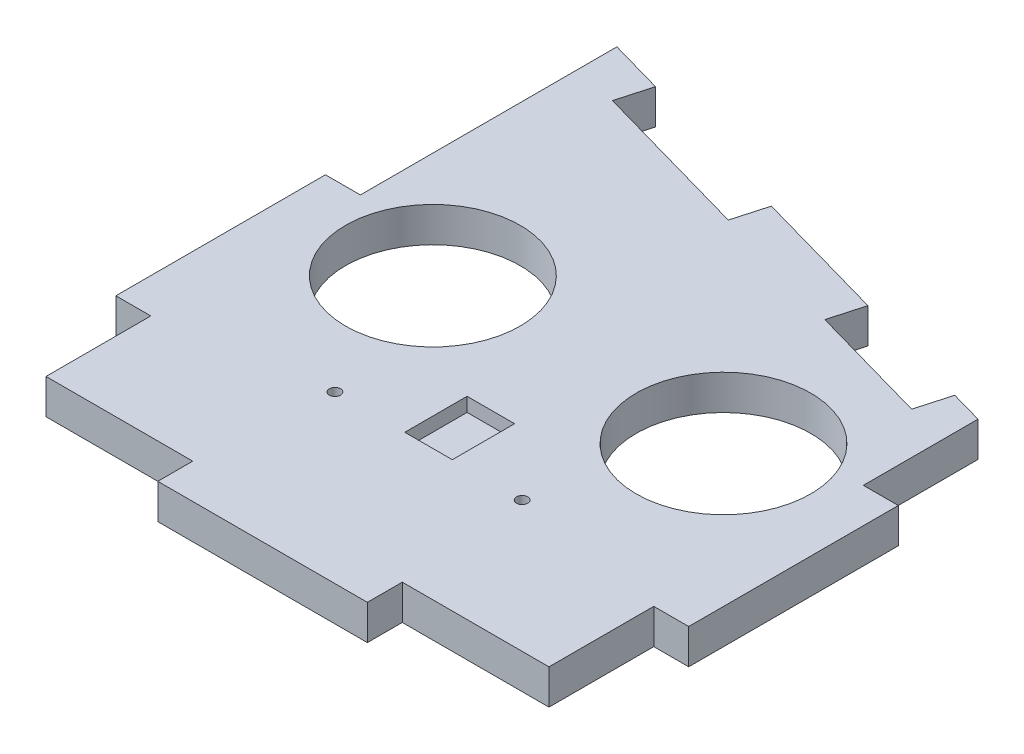
ISO-10303-21;
HEADER;
FILE_DESCRIPTION(('STEP AP214'),'2;1');
FILE_NAME('part.step','',(''),(''),'','','');
FILE_SCHEMA(('AUTOMOTIVE_DESIGN { 1 0 10303 214 1 1 1 1 }'));
ENDSEC;
DATA;
#1=APPLICATION_CONTEXT('core data for automotive mechanical design processes');
#2=APPLICATION_PROTOCOL_DEFINITION('international standard','automotive_design',2000,#1);
#3=PRODUCT_CONTEXT('',#1,'mechanical');
#4=PRODUCT('Part','Part','',(#3));
#5=PRODUCT_RELATED_PRODUCT_CATEGORY('part','',(#4));
#6=PRODUCT_DEFINITION_FORMATION('','',#4);
#7=PRODUCT_DEFINITION_CONTEXT('part definition',#1,'design');
#8=PRODUCT_DEFINITION('design','',#6,#7);
#9=PRODUCT_DEFINITION_SHAPE('','',#8);
#10=(LENGTH_UNIT() NAMED_UNIT(*) SI_UNIT(.MILLI.,.METRE.));
#11=(NAMED_UNIT(*) PLANE_ANGLE_UNIT() SI_UNIT($,.RADIAN.));
#12=(NAMED_UNIT(*) SI_UNIT($,.STERADIAN.) SOLID_ANGLE_UNIT());
#13=UNCERTAINTY_MEASURE_WITH_UNIT(LENGTH_MEASURE(1.E-05),#10,'distance_accuracy_value','');
#14=(GEOMETRIC_REPRESENTATION_CONTEXT(3) GLOBAL_UNCERTAINTY_ASSIGNED_CONTEXT((#13)) GLOBAL_UNIT_ASSIGNED_CONTEXT((#10,
#11,#12)) REPRESENTATION_CONTEXT('',''));
#15=CARTESIAN_POINT('',(0.,0.,0.));
#16=DIRECTION('',(0.,0.,1.));
#17=DIRECTION('',(1.,0.,0.));
#18=AXIS2_PLACEMENT_3D('',#15,#16,#17);
#19=CARTESIAN_POINT('',(0.,3.175,0.));
#20=DIRECTION('',(0.,1.,0.));
#21=DIRECTION('',(0.,0.,1.));
#22=AXIS2_PLACEMENT_3D('',#19,#20,#21);
#23=PLANE('',#22);
#24=CARTESIAN_POINT('',(34.544,3.175,-11.9107261914071));
#25=DIRECTION('',(0.,1.,0.));
#26=DIRECTION('',(0.,0.,1.));
#27=AXIS2_PLACEMENT_3D('',#24,#25,#26);
#28=CIRCLE('',#27,0.508000000000002);
#29=CARTESIAN_POINT('',(34.544,3.175,-11.4027261914071));
#30=VERTEX_POINT('',#29);
#31=EDGE_CURVE('E468',#30,#30,#28,.T.);
#32=ORIENTED_EDGE('',*,*,#31,.F.);
#33=EDGE_LOOP('',(#32));
#34=FACE_BOUND('',#33,.T.);
#35=CARTESIAN_POINT('',(17.526,3.175,-11.9107261914071));
#36=DIRECTION('',(0.,1.,0.));
#37=DIRECTION('',(0.,0.,1.));
#38=AXIS2_PLACEMENT_3D('',#35,#36,#37);
#39=CIRCLE('',#38,0.508000000000002);
#40=CARTESIAN_POINT('',(17.526,3.175,-11.4027261914071));
#41=VERTEX_POINT('',#40);
#42=EDGE_CURVE('E462',#41,#41,#39,.T.);
#43=ORIENTED_EDGE('',*,*,#42,.F.);
#44=EDGE_LOOP('',(#43));
#45=FACE_BOUND('',#44,.T.);
#46=DIRECTION('',(0.,0.,1.));
#47=VECTOR('',#46,1.);
#48=CARTESIAN_POINT('',(23.876,3.175,-17.5749261914071));
#49=LINE('',#48,#47);
#50=CARTESIAN_POINT('',(23.876,3.175,-17.5749261914071));
#51=VERTEX_POINT('',#50);
#52=CARTESIAN_POINT('',(23.876,3.175,-11.9107261914071));
#53=VERTEX_POINT('',#52);
#54=EDGE_CURVE('E48',#51,#53,#49,.T.);
#55=ORIENTED_EDGE('',*,*,#54,.F.);
#56=DIRECTION('',(-1.,0.,0.));
#57=VECTOR('',#56,1.);
#58=CARTESIAN_POINT('',(23.876,3.175,-17.5749261914071));
#59=LINE('',#58,#57);
#60=CARTESIAN_POINT('',(28.194,3.175,-17.5749261914071));
#61=VERTEX_POINT('',#60);
#62=EDGE_CURVE('E440',#61,#51,#59,.T.);
#63=ORIENTED_EDGE('',*,*,#62,.F.);
#64=DIRECTION('',(0.,0.,-1.));
#65=VECTOR('',#64,1.);
#66=CARTESIAN_POINT('',(28.194,3.175,-17.5749261914071));
#67=LINE('',#66,#65);
#68=CARTESIAN_POINT('',(28.194,3.175,-11.9107261914071));
#69=VERTEX_POINT('',#68);
#70=EDGE_CURVE('E444',#69,#61,#67,.T.);
#71=ORIENTED_EDGE('',*,*,#70,.F.);
#72=DIRECTION('',(1.,0.,0.));
#73=VECTOR('',#72,1.);
#74=CARTESIAN_POINT('',(23.876,3.175,-11.9107261914071));
#75=LINE('',#74,#73);
#76=EDGE_CURVE('E447',#53,#69,#75,.T.);
#77=ORIENTED_EDGE('',*,*,#76,.F.);
#78=EDGE_LOOP('',(#55,#63,#71,#77));
#79=FACE_BOUND('',#78,.T.);
#80=CARTESIAN_POINT('',(12.827,3.175,-25.5124261914071));
#81=DIRECTION('',(0.,1.,0.));
#82=DIRECTION('',(0.,0.,1.));
#83=AXIS2_PLACEMENT_3D('',#80,#81,#82);
#84=CIRCLE('',#83,7.9375);
#85=CARTESIAN_POINT('',(12.827,3.175,-17.5749261914071));
#86=VERTEX_POINT('',#85);
#87=EDGE_CURVE('E242',#86,#86,#84,.T.);
#88=ORIENTED_EDGE('',*,*,#87,.F.);
#89=EDGE_LOOP('',(#88));
#90=FACE_BOUND('',#89,.T.);
#91=DIRECTION('',(0.,0.,1.));
#92=VECTOR('',#91,1.);
#93=CARTESIAN_POINT('',(16.51,3.175,0.));
#94=LINE('',#93,#92);
#95=CARTESIAN_POINT('',(16.51,3.175,0.));
#96=VERTEX_POINT('',#95);
#97=CARTESIAN_POINT('',(16.51,3.175,3.175));
#98=VERTEX_POINT('',#97);
#99=EDGE_CURVE('E286',#96,#98,#94,.T.);
#100=ORIENTED_EDGE('',*,*,#99,.T.);
#101=DIRECTION('',(1.,0.,0.));
#102=VECTOR('',#101,1.);
#103=CARTESIAN_POINT('',(16.51,3.175,3.175));
#104=LINE('',#103,#102);
#105=CARTESIAN_POINT('',(35.56,3.175,3.175));
#106=VERTEX_POINT('',#105);
#107=EDGE_CURVE('E146',#98,#106,#104,.T.);
#108=ORIENTED_EDGE('',*,*,#107,.T.);
#109=DIRECTION('',(0.,0.,-1.));
#110=VECTOR('',#109,1.);
#111=CARTESIAN_POINT('',(35.56,3.175,3.175));
#112=LINE('',#111,#110);
#113=CARTESIAN_POINT('',(35.56,3.175,0.));
#114=VERTEX_POINT('',#113);
#115=EDGE_CURVE('E349',#106,#114,#112,.T.);
#116=ORIENTED_EDGE('',*,*,#115,.T.);
#117=DIRECTION('',(1.,0.,0.));
#118=VECTOR('',#117,1.);
#119=CARTESIAN_POINT('',(35.56,3.175,0.));
#120=LINE('',#119,#118);
#121=CARTESIAN_POINT('',(48.895,3.175,0.));
#122=VERTEX_POINT('',#121);
#123=EDGE_CURVE('E368',#114,#122,#120,.T.);
#124=ORIENTED_EDGE('',*,*,#123,.T.);
#125=DIRECTION('',(0.,0.,-1.));
#126=VECTOR('',#125,1.);
#127=CARTESIAN_POINT('',(48.895,3.175,0.));
#128=LINE('',#127,#126);
#129=CARTESIAN_POINT('',(48.895,3.175,-9.525));
#130=VERTEX_POINT('',#129);
#131=EDGE_CURVE('E365',#122,#130,#128,.T.);
#132=ORIENTED_EDGE('',*,*,#131,.T.);
#133=DIRECTION('',(1.,0.,0.));
#134=VECTOR('',#133,1.);
#135=CARTESIAN_POINT('',(52.07,3.175,-9.525));
#136=LINE('',#135,#134);
#137=CARTESIAN_POINT('',(52.07,3.175,-9.525));
#138=VERTEX_POINT('',#137);
#139=EDGE_CURVE('E367',#130,#138,#136,.T.);
#140=ORIENTED_EDGE('',*,*,#139,.T.);
#141=DIRECTION('',(0.,0.,-1.));
#142=VECTOR('',#141,1.);
#143=CARTESIAN_POINT('',(52.07,3.175,-28.575));
#144=LINE('',#143,#142);
#145=CARTESIAN_POINT('',(52.07,3.175,-28.575));
#146=VERTEX_POINT('',#145);
#147=EDGE_CURVE('E370',#138,#146,#144,.T.);
#148=ORIENTED_EDGE('',*,*,#147,.T.);
#149=DIRECTION('',(-1.,0.,0.));
#150=VECTOR('',#149,1.);
#151=CARTESIAN_POINT('',(48.895,3.175,-28.575));
#152=LINE('',#151,#150);
#153=CARTESIAN_POINT('',(48.895,3.175,-28.575));
#154=VERTEX_POINT('',#153);
#155=EDGE_CURVE('E376',#146,#154,#152,.T.);
#156=ORIENTED_EDGE('',*,*,#155,.T.);
#157=DIRECTION('',(0.,0.,-1.));
#158=VECTOR('',#157,1.);
#159=CARTESIAN_POINT('',(48.895,3.175,-28.575));
#160=LINE('',#159,#158);
#161=CARTESIAN_POINT('',(48.895,3.175,-38.9956183909462));
#162=VERTEX_POINT('',#161);
#163=EDGE_CURVE('E378',#154,#162,#160,.T.);
#164=ORIENTED_EDGE('',*,*,#163,.T.);
#165=DIRECTION('',(-0.962441314553987,0.,-0.271489808353083));
#166=VECTOR('',#165,1.);
#167=CARTESIAN_POINT('',(45.9584976525822,3.175,-39.823960283042));
#168=LINE('',#167,#166);
#169=CARTESIAN_POINT('',(45.9584976525822,3.175,-39.823960283042));
#170=VERTEX_POINT('',#169);
#171=EDGE_CURVE('E380',#162,#170,#168,.T.);
#172=ORIENTED_EDGE('',*,*,#171,.T.);
#173=DIRECTION('',(-0.271489808353069,0.,0.962441314553991));
#174=VECTOR('',#173,1.);
#175=CARTESIAN_POINT('',(45.9584976525822,3.175,-39.823960283042));
#176=LINE('',#175,#174);
#177=CARTESIAN_POINT('',(45.0965175110612,3.175,-36.7682091093331));
#178=VERTEX_POINT('',#177);
#179=EDGE_CURVE('E382',#170,#178,#176,.T.);
#180=ORIENTED_EDGE('',*,*,#179,.T.);
#181=DIRECTION('',(-0.962441314553991,0.,-0.271489808353068));
#182=VECTOR('',#181,1.);
#183=CARTESIAN_POINT('',(45.0965175110612,3.175,-36.7682091093331));
#184=LINE('',#183,#182);
#185=CARTESIAN_POINT('',(34.0958132857091,3.175,-39.8713376188087));
#186=VERTEX_POINT('',#185);
#187=EDGE_CURVE('E384',#178,#186,#184,.T.);
#188=ORIENTED_EDGE('',*,*,#187,.T.);
#189=DIRECTION('',(0.271489808353067,0.,-0.962441314553991));
#190=VECTOR('',#189,1.);
#191=CARTESIAN_POINT('',(34.0958132857091,3.175,-39.8713376188087));
#192=LINE('',#191,#190);
#193=CARTESIAN_POINT('',(34.9577934272301,3.175,-42.9270887925176));
#194=VERTEX_POINT('',#193);
#195=EDGE_CURVE('E386',#186,#194,#192,.T.);
#196=ORIENTED_EDGE('',*,*,#195,.T.);
#197=DIRECTION('',(-0.962441314553991,0.,-0.271489808353068));
#198=VECTOR('',#197,1.);
#199=CARTESIAN_POINT('',(34.9577934272301,3.175,-42.9270887925176));
#200=LINE('',#199,#198);
#201=CARTESIAN_POINT('',(22.7347887323944,3.175,-46.3750093586016));
#202=VERTEX_POINT('',#201);
#203=EDGE_CURVE('E388',#194,#202,#200,.T.);
#204=ORIENTED_EDGE('',*,*,#203,.T.);
#205=DIRECTION('',(-0.271489808353069,0.,0.962441314553991));
#206=VECTOR('',#205,1.);
#207=CARTESIAN_POINT('',(22.7347887323944,3.175,-46.3750093586016));
#208=LINE('',#207,#206);
#209=CARTESIAN_POINT('',(21.8728085908734,3.175,-43.3192581848926));
#210=VERTEX_POINT('',#209);
#211=EDGE_CURVE('E390',#202,#210,#208,.T.);
#212=ORIENTED_EDGE('',*,*,#211,.T.);
#213=DIRECTION('',(-0.962441314553991,0.,-0.271489808353068));
#214=VECTOR('',#213,1.);
#215=CARTESIAN_POINT('',(21.8728085908734,3.175,-43.3192581848926));
#216=LINE('',#215,#214);
#217=CARTESIAN_POINT('',(7.20520295707056,3.175,-47.4567628641934));
#218=VERTEX_POINT('',#217);
#219=EDGE_CURVE('E392',#210,#218,#216,.T.);
#220=ORIENTED_EDGE('',*,*,#219,.T.);
#221=DIRECTION('',(0.271489808353068,0.,-0.962441314553991));
#222=VECTOR('',#221,1.);
#223=CARTESIAN_POINT('',(7.20520295707056,3.175,-47.4567628641934));
#224=LINE('',#223,#222);
#225=CARTESIAN_POINT('',(8.06718309859155,3.175,-50.5125140379023));
#226=VERTEX_POINT('',#225);
#227=EDGE_CURVE('E394',#218,#226,#224,.T.);
#228=ORIENTED_EDGE('',*,*,#227,.T.);
#229=DIRECTION('',(-0.962441314553991,0.,-0.271489808353068));
#230=VECTOR('',#229,1.);
#231=CARTESIAN_POINT('',(8.06718309859155,3.175,-50.5125140379023));
#232=LINE('',#231,#230);
#233=CARTESIAN_POINT('',(3.175,3.175,-51.8925232205715));
#234=VERTEX_POINT('',#233);
#235=EDGE_CURVE('E396',#226,#234,#232,.T.);
#236=ORIENTED_EDGE('',*,*,#235,.T.);
#237=DIRECTION('',(0.,0.,1.));
#238=VECTOR('',#237,1.);
#239=CARTESIAN_POINT('',(3.175,3.175,-28.575));
#240=LINE('',#239,#238);
#241=CARTESIAN_POINT('',(3.175,3.175,-28.575));
#242=VERTEX_POINT('',#241);
#243=EDGE_CURVE('E398',#234,#242,#240,.T.);
#244=ORIENTED_EDGE('',*,*,#243,.T.);
#245=DIRECTION('',(-1.,0.,0.));
#246=VECTOR('',#245,1.);
#247=CARTESIAN_POINT('',(0.,3.175,-28.575));
#248=LINE('',#247,#246);
#249=CARTESIAN_POINT('',(0.,3.175,-28.575));
#250=VERTEX_POINT('',#249);
#251=EDGE_CURVE('E400',#242,#250,#248,.T.);
#252=ORIENTED_EDGE('',*,*,#251,.T.);
#253=DIRECTION('',(0.,0.,1.));
#254=VECTOR('',#253,1.);
#255=CARTESIAN_POINT('',(0.,3.175,-28.575));
#256=LINE('',#255,#254);
#257=CARTESIAN_POINT('',(0.,3.175,-9.525));
#258=VERTEX_POINT('',#257);
#259=EDGE_CURVE('E217',#250,#258,#256,.T.);
#260=ORIENTED_EDGE('',*,*,#259,.T.);
#261=DIRECTION('',(1.,0.,0.));
#262=VECTOR('',#261,1.);
#263=CARTESIAN_POINT('',(3.175,3.175,-9.525));
#264=LINE('',#263,#262);
#265=CARTESIAN_POINT('',(3.175,3.175,-9.525));
#266=VERTEX_POINT('',#265);
#267=EDGE_CURVE('E210',#258,#266,#264,.T.);
#268=ORIENTED_EDGE('',*,*,#267,.T.);
#269=DIRECTION('',(0.,0.,1.));
#270=VECTOR('',#269,1.);
#271=CARTESIAN_POINT('',(3.175,3.175,-9.525));
#272=LINE('',#271,#270);
#273=CARTESIAN_POINT('',(3.175,3.175,0.));
#274=VERTEX_POINT('',#273);
#275=EDGE_CURVE('E214',#266,#274,#272,.T.);
#276=ORIENTED_EDGE('',*,*,#275,.T.);
#277=DIRECTION('',(1.,0.,0.));
#278=VECTOR('',#277,1.);
#279=CARTESIAN_POINT('',(16.51,3.175,0.));
#280=LINE('',#279,#278);
#281=EDGE_CURVE('E57',#274,#96,#280,.T.);
#282=ORIENTED_EDGE('',*,*,#281,.T.);
#283=EDGE_LOOP('',(#100,#108,#116,#124,#132,#140,#148,#156,#164,#172,#180,#188,#196,#204,#212,
#220,#228,#236,#244,#252,#260,#268,#276,#282));
#284=FACE_BOUND('',#283,.T.);
#285=CARTESIAN_POINT('',(39.243,3.175,-25.5124261914071));
#286=DIRECTION('',(0.,1.,0.));
#287=DIRECTION('',(0.,0.,1.));
#288=AXIS2_PLACEMENT_3D('',#285,#286,#287);
#289=CIRCLE('',#288,7.9375);
#290=CARTESIAN_POINT('',(39.243,3.175,-17.5749261914071));
#291=VERTEX_POINT('',#290);
#292=EDGE_CURVE('E421',#291,#291,#289,.T.);
#293=ORIENTED_EDGE('',*,*,#292,.F.);
#294=EDGE_LOOP('',(#293));
#295=FACE_BOUND('',#294,.T.);
#296=ADVANCED_FACE('F33',(#34,#45,#79,#90,#284,#295),#23,.T.);
#297=CARTESIAN_POINT('',(0.,0.,0.));
#298=DIRECTION('',(0.,1.,0.));
#299=DIRECTION('',(0.,0.,1.));
#300=AXIS2_PLACEMENT_3D('',#297,#298,#299);
#301=PLANE('',#300);
#302=CARTESIAN_POINT('',(34.544,0.,-11.9107261914071));
#303=DIRECTION('',(0.,1.,0.));
#304=DIRECTION('',(0.,0.,1.));
#305=AXIS2_PLACEMENT_3D('',#302,#303,#304);
#306=CIRCLE('',#305,0.508000000000002);
#307=CARTESIAN_POINT('',(34.544,0.,-11.4027261914071));
#308=VERTEX_POINT('',#307);
#309=EDGE_CURVE('E465',#308,#308,#306,.T.);
#310=ORIENTED_EDGE('',*,*,#309,.T.);
#311=EDGE_LOOP('',(#310));
#312=FACE_BOUND('',#311,.T.);
#313=CARTESIAN_POINT('',(17.526,0.,-11.9107261914071));
#314=DIRECTION('',(0.,1.,0.));
#315=DIRECTION('',(0.,0.,1.));
#316=AXIS2_PLACEMENT_3D('',#313,#314,#315);
#317=CIRCLE('',#316,0.508000000000002);
#318=CARTESIAN_POINT('',(17.526,0.,-11.4027261914071));
#319=VERTEX_POINT('',#318);
#320=EDGE_CURVE('E451',#319,#319,#317,.T.);
#321=ORIENTED_EDGE('',*,*,#320,.T.);
#322=EDGE_LOOP('',(#321));
#323=FACE_BOUND('',#322,.T.);
#324=DIRECTION('',(0.,0.,1.));
#325=VECTOR('',#324,1.);
#326=CARTESIAN_POINT('',(16.51,0.,0.));
#327=LINE('',#326,#325);
#328=CARTESIAN_POINT('',(16.51,0.,0.));
#329=VERTEX_POINT('',#328);
#330=CARTESIAN_POINT('',(16.51,0.,3.175));
#331=VERTEX_POINT('',#330);
#332=EDGE_CURVE('E238',#329,#331,#327,.T.);
#333=ORIENTED_EDGE('',*,*,#332,.F.);
#334=DIRECTION('',(1.,0.,0.));
#335=VECTOR('',#334,1.);
#336=CARTESIAN_POINT('',(16.51,0.,0.));
#337=LINE('',#336,#335);
#338=CARTESIAN_POINT('',(3.175,0.,0.));
#339=VERTEX_POINT('',#338);
#340=EDGE_CURVE('E138',#339,#329,#337,.T.);
#341=ORIENTED_EDGE('',*,*,#340,.F.);
#342=DIRECTION('',(0.,0.,1.));
#343=VECTOR('',#342,1.);
#344=CARTESIAN_POINT('',(3.175,0.,-9.525));
#345=LINE('',#344,#343);
#346=CARTESIAN_POINT('',(3.175,0.,-9.525));
#347=VERTEX_POINT('',#346);
#348=EDGE_CURVE('E283',#347,#339,#345,.T.);
#349=ORIENTED_EDGE('',*,*,#348,.F.);
#350=DIRECTION('',(1.,0.,0.));
#351=VECTOR('',#350,1.);
#352=CARTESIAN_POINT('',(3.175,0.,-9.525));
#353=LINE('',#352,#351);
#354=CARTESIAN_POINT('',(0.,0.,-9.525));
#355=VERTEX_POINT('',#354);
#356=EDGE_CURVE('E226',#355,#347,#353,.T.);
#357=ORIENTED_EDGE('',*,*,#356,.F.);
#358=DIRECTION('',(0.,0.,1.));
#359=VECTOR('',#358,1.);
#360=CARTESIAN_POINT('',(0.,0.,-28.575));
#361=LINE('',#360,#359);
#362=CARTESIAN_POINT('',(0.,0.,-28.575));
#363=VERTEX_POINT('',#362);
#364=EDGE_CURVE('E280',#363,#355,#361,.T.);
#365=ORIENTED_EDGE('',*,*,#364,.F.);
#366=DIRECTION('',(-1.,0.,0.));
#367=VECTOR('',#366,1.);
#368=CARTESIAN_POINT('',(0.,0.,-28.575));
#369=LINE('',#368,#367);
#370=CARTESIAN_POINT('',(3.175,0.,-28.575));
#371=VERTEX_POINT('',#370);
#372=EDGE_CURVE('E278',#371,#363,#369,.T.);
#373=ORIENTED_EDGE('',*,*,#372,.F.);
#374=DIRECTION('',(0.,0.,1.));
#375=VECTOR('',#374,1.);
#376=CARTESIAN_POINT('',(3.175,0.,-28.575));
#377=LINE('',#376,#375);
#378=CARTESIAN_POINT('',(3.175,0.,-51.8925232205715));
#379=VERTEX_POINT('',#378);
#380=EDGE_CURVE('E276',#379,#371,#377,.T.);
#381=ORIENTED_EDGE('',*,*,#380,.F.);
#382=DIRECTION('',(-0.962441314553991,0.,-0.271489808353068));
#383=VECTOR('',#382,1.);
#384=CARTESIAN_POINT('',(8.06718309859155,0.,-50.5125140379023));
#385=LINE('',#384,#383);
#386=CARTESIAN_POINT('',(8.06718309859155,0.,-50.5125140379023));
#387=VERTEX_POINT('',#386);
#388=EDGE_CURVE('E274',#387,#379,#385,.T.);
#389=ORIENTED_EDGE('',*,*,#388,.F.);
#390=DIRECTION('',(0.271489808353068,0.,-0.962441314553991));
#391=VECTOR('',#390,1.);
#392=CARTESIAN_POINT('',(7.20520295707056,0.,-47.4567628641934));
#393=LINE('',#392,#391);
#394=CARTESIAN_POINT('',(7.20520295707056,0.,-47.4567628641934));
#395=VERTEX_POINT('',#394);
#396=EDGE_CURVE('E272',#395,#387,#393,.T.);
#397=ORIENTED_EDGE('',*,*,#396,.F.);
#398=DIRECTION('',(-0.962441314553991,0.,-0.271489808353068));
#399=VECTOR('',#398,1.);
#400=CARTESIAN_POINT('',(21.8728085908734,0.,-43.3192581848926));
#401=LINE('',#400,#399);
#402=CARTESIAN_POINT('',(21.8728085908734,0.,-43.3192581848926));
#403=VERTEX_POINT('',#402);
#404=EDGE_CURVE('E270',#403,#395,#401,.T.);
#405=ORIENTED_EDGE('',*,*,#404,.F.);
#406=DIRECTION('',(-0.271489808353069,0.,0.962441314553991));
#407=VECTOR('',#406,1.);
#408=CARTESIAN_POINT('',(22.7347887323944,0.,-46.3750093586016));
#409=LINE('',#408,#407);
#410=CARTESIAN_POINT('',(22.7347887323944,0.,-46.3750093586016));
#411=VERTEX_POINT('',#410);
#412=EDGE_CURVE('E268',#411,#403,#409,.T.);
#413=ORIENTED_EDGE('',*,*,#412,.F.);
#414=DIRECTION('',(-0.962441314553991,0.,-0.271489808353068));
#415=VECTOR('',#414,1.);
#416=CARTESIAN_POINT('',(34.9577934272301,0.,-42.9270887925176));
#417=LINE('',#416,#415);
#418=CARTESIAN_POINT('',(34.9577934272301,0.,-42.9270887925176));
#419=VERTEX_POINT('',#418);
#420=EDGE_CURVE('E266',#419,#411,#417,.T.);
#421=ORIENTED_EDGE('',*,*,#420,.F.);
#422=DIRECTION('',(0.271489808353067,0.,-0.962441314553991));
#423=VECTOR('',#422,1.);
#424=CARTESIAN_POINT('',(34.0958132857091,0.,-39.8713376188087));
#425=LINE('',#424,#423);
#426=CARTESIAN_POINT('',(34.0958132857091,0.,-39.8713376188087));
#427=VERTEX_POINT('',#426);
#428=EDGE_CURVE('E264',#427,#419,#425,.T.);
#429=ORIENTED_EDGE('',*,*,#428,.F.);
#430=DIRECTION('',(-0.962441314553991,0.,-0.271489808353068));
#431=VECTOR('',#430,1.);
#432=CARTESIAN_POINT('',(45.0965175110612,0.,-36.7682091093331));
#433=LINE('',#432,#431);
#434=CARTESIAN_POINT('',(45.0965175110612,0.,-36.7682091093331));
#435=VERTEX_POINT('',#434);
#436=EDGE_CURVE('E262',#435,#427,#433,.T.);
#437=ORIENTED_EDGE('',*,*,#436,.F.);
#438=DIRECTION('',(-0.271489808353069,0.,0.962441314553991));
#439=VECTOR('',#438,1.);
#440=CARTESIAN_POINT('',(45.9584976525822,0.,-39.823960283042));
#441=LINE('',#440,#439);
#442=CARTESIAN_POINT('',(45.9584976525822,0.,-39.823960283042));
#443=VERTEX_POINT('',#442);
#444=EDGE_CURVE('E260',#443,#435,#441,.T.);
#445=ORIENTED_EDGE('',*,*,#444,.F.);
#446=DIRECTION('',(-0.962441314553987,0.,-0.271489808353083));
#447=VECTOR('',#446,1.);
#448=CARTESIAN_POINT('',(45.9584976525822,0.,-39.823960283042));
#449=LINE('',#448,#447);
#450=CARTESIAN_POINT('',(48.895,0.,-38.9956183909462));
#451=VERTEX_POINT('',#450);
#452=EDGE_CURVE('E258',#451,#443,#449,.T.);
#453=ORIENTED_EDGE('',*,*,#452,.F.);
#454=DIRECTION('',(0.,0.,-1.));
#455=VECTOR('',#454,1.);
#456=CARTESIAN_POINT('',(48.895,0.,-28.575));
#457=LINE('',#456,#455);
#458=CARTESIAN_POINT('',(48.895,0.,-28.575));
#459=VERTEX_POINT('',#458);
#460=EDGE_CURVE('E256',#459,#451,#457,.T.);
#461=ORIENTED_EDGE('',*,*,#460,.F.);
#462=DIRECTION('',(-1.,0.,0.));
#463=VECTOR('',#462,1.);
#464=CARTESIAN_POINT('',(48.895,0.,-28.575));
#465=LINE('',#464,#463);
#466=CARTESIAN_POINT('',(52.07,0.,-28.575));
#467=VERTEX_POINT('',#466);
#468=EDGE_CURVE('E254',#467,#459,#465,.T.);
#469=ORIENTED_EDGE('',*,*,#468,.F.);
#470=DIRECTION('',(0.,0.,-1.));
#471=VECTOR('',#470,1.);
#472=CARTESIAN_POINT('',(52.07,0.,-28.575));
#473=LINE('',#472,#471);
#474=CARTESIAN_POINT('',(52.07,0.,-9.525));
#475=VERTEX_POINT('',#474);
#476=EDGE_CURVE('E252',#475,#467,#473,.T.);
#477=ORIENTED_EDGE('',*,*,#476,.F.);
#478=DIRECTION('',(1.,0.,0.));
#479=VECTOR('',#478,1.);
#480=CARTESIAN_POINT('',(52.07,0.,-9.525));
#481=LINE('',#480,#479);
#482=CARTESIAN_POINT('',(48.895,0.,-9.525));
#483=VERTEX_POINT('',#482);
#484=EDGE_CURVE('E250',#483,#475,#481,.T.);
#485=ORIENTED_EDGE('',*,*,#484,.F.);
#486=DIRECTION('',(0.,0.,-1.));
#487=VECTOR('',#486,1.);
#488=CARTESIAN_POINT('',(48.895,0.,0.));
#489=LINE('',#488,#487);
#490=CARTESIAN_POINT('',(48.895,0.,0.));
#491=VERTEX_POINT('',#490);
#492=EDGE_CURVE('E248',#491,#483,#489,.T.);
#493=ORIENTED_EDGE('',*,*,#492,.F.);
#494=DIRECTION('',(1.,0.,0.));
#495=VECTOR('',#494,1.);
#496=CARTESIAN_POINT('',(35.56,0.,0.));
#497=LINE('',#496,#495);
#498=CARTESIAN_POINT('',(35.56,0.,0.));
#499=VERTEX_POINT('',#498);
#500=EDGE_CURVE('E246',#499,#491,#497,.T.);
#501=ORIENTED_EDGE('',*,*,#500,.F.);
#502=DIRECTION('',(0.,0.,-1.));
#503=VECTOR('',#502,1.);
#504=CARTESIAN_POINT('',(35.56,0.,3.175));
#505=LINE('',#504,#503);
#506=CARTESIAN_POINT('',(35.56,0.,3.175));
#507=VERTEX_POINT('',#506);
#508=EDGE_CURVE('E244',#507,#499,#505,.T.);
#509=ORIENTED_EDGE('',*,*,#508,.F.);
#510=DIRECTION('',(1.,0.,0.));
#511=VECTOR('',#510,1.);
#512=CARTESIAN_POINT('',(16.51,0.,3.175));
#513=LINE('',#512,#511);
#514=EDGE_CURVE('E241',#331,#507,#513,.T.);
#515=ORIENTED_EDGE('',*,*,#514,.F.);
#516=EDGE_LOOP('',(#333,#341,#349,#357,#365,#373,#381,#389,#397,#405,#413,#421,#429,#437,#445,
#453,#461,#469,#477,#485,#493,#501,#509,#515));
#517=FACE_BOUND('',#516,.T.);
#518=CARTESIAN_POINT('',(12.827,0.,-25.5124261914071));
#519=DIRECTION('',(0.,1.,0.));
#520=DIRECTION('',(0.,0.,1.));
#521=AXIS2_PLACEMENT_3D('',#518,#519,#520);
#522=CIRCLE('',#521,7.9375);
#523=CARTESIAN_POINT('',(12.827,0.,-17.5749261914071));
#524=VERTEX_POINT('',#523);
#525=EDGE_CURVE('E418',#524,#524,#522,.T.);
#526=ORIENTED_EDGE('',*,*,#525,.T.);
#527=EDGE_LOOP('',(#526));
#528=FACE_BOUND('',#527,.T.);
#529=CARTESIAN_POINT('',(39.243,0.,-25.5124261914071));
#530=DIRECTION('',(0.,1.,0.));
#531=DIRECTION('',(0.,0.,1.));
#532=AXIS2_PLACEMENT_3D('',#529,#530,#531);
#533=CIRCLE('',#532,7.9375);
#534=CARTESIAN_POINT('',(39.243,0.,-17.5749261914071));
#535=VERTEX_POINT('',#534);
#536=EDGE_CURVE('E424',#535,#535,#533,.T.);
#537=ORIENTED_EDGE('',*,*,#536,.T.);
#538=EDGE_LOOP('',(#537));
#539=FACE_BOUND('',#538,.T.);
#540=ADVANCED_FACE('F353',(#312,#323,#517,#528,#539),#301,.F.);
#541=CARTESIAN_POINT('',(16.51,3.175,0.));
#542=DIRECTION('',(1.,0.,0.));
#543=DIRECTION('',(0.,0.,-1.));
#544=AXIS2_PLACEMENT_3D('',#541,#542,#543);
#545=PLANE('',#544);
#546=ORIENTED_EDGE('',*,*,#332,.T.);
#547=DIRECTION('',(0.,-1.,0.));
#548=VECTOR('',#547,1.);
#549=CARTESIAN_POINT('',(16.51,3.175,3.175));
#550=LINE('',#549,#548);
#551=EDGE_CURVE('E11',#98,#331,#550,.T.);
#552=ORIENTED_EDGE('',*,*,#551,.F.);
#553=ORIENTED_EDGE('',*,*,#99,.F.);
#554=DIRECTION('',(0.,-1.,0.));
#555=VECTOR('',#554,1.);
#556=CARTESIAN_POINT('',(16.51,3.175,0.));
#557=LINE('',#556,#555);
#558=EDGE_CURVE('E234',#96,#329,#557,.T.);
#559=ORIENTED_EDGE('',*,*,#558,.T.);
#560=EDGE_LOOP('',(#546,#552,#553,#559));
#561=FACE_BOUND('',#560,.T.);
#562=ADVANCED_FACE('F35',(#561),#545,.F.);
#563=CARTESIAN_POINT('',(16.51,3.175,3.175));
#564=DIRECTION('',(0.,0.,-1.));
#565=DIRECTION('',(-1.,0.,0.));
#566=AXIS2_PLACEMENT_3D('',#563,#564,#565);
#567=PLANE('',#566);
#568=ORIENTED_EDGE('',*,*,#514,.T.);
#569=DIRECTION('',(0.,-1.,0.));
#570=VECTOR('',#569,1.);
#571=CARTESIAN_POINT('',(35.56,3.175,3.175));
#572=LINE('',#571,#570);
#573=EDGE_CURVE('E41',#106,#507,#572,.T.);
#574=ORIENTED_EDGE('',*,*,#573,.F.);
#575=ORIENTED_EDGE('',*,*,#107,.F.);
#576=ORIENTED_EDGE('',*,*,#551,.T.);
#577=EDGE_LOOP('',(#568,#574,#575,#576));
#578=FACE_BOUND('',#577,.T.);
#579=ADVANCED_FACE('F586',(#578),#567,.F.);
#580=CARTESIAN_POINT('',(35.56,3.175,3.175));
#581=DIRECTION('',(-1.,0.,0.));
#582=DIRECTION('',(0.,0.,1.));
#583=AXIS2_PLACEMENT_3D('',#580,#581,#582);
#584=PLANE('',#583);
#585=ORIENTED_EDGE('',*,*,#508,.T.);
#586=DIRECTION('',(0.,-1.,0.));
#587=VECTOR('',#586,1.);
#588=CARTESIAN_POINT('',(35.56,3.175,0.));
#589=LINE('',#588,#587);
#590=EDGE_CURVE('E341',#114,#499,#589,.T.);
#591=ORIENTED_EDGE('',*,*,#590,.F.);
#592=ORIENTED_EDGE('',*,*,#115,.F.);
#593=ORIENTED_EDGE('',*,*,#573,.T.);
#594=EDGE_LOOP('',(#585,#591,#592,#593));
#595=FACE_BOUND('',#594,.T.);
#596=ADVANCED_FACE('F347',(#595),#584,.F.);
#597=CARTESIAN_POINT('',(35.56,3.175,0.));
#598=DIRECTION('',(0.,0.,-1.));
#599=DIRECTION('',(-1.,0.,0.));
#600=AXIS2_PLACEMENT_3D('',#597,#598,#599);
#601=PLANE('',#600);
#602=ORIENTED_EDGE('',*,*,#500,.T.);
#603=DIRECTION('',(0.,-1.,0.));
#604=VECTOR('',#603,1.);
#605=CARTESIAN_POINT('',(48.895,3.175,0.));
#606=LINE('',#605,#604);
#607=EDGE_CURVE('E338',#122,#491,#606,.T.);
#608=ORIENTED_EDGE('',*,*,#607,.F.);
#609=ORIENTED_EDGE('',*,*,#123,.F.);
#610=ORIENTED_EDGE('',*,*,#590,.T.);
#611=EDGE_LOOP('',(#602,#608,#609,#610));
#612=FACE_BOUND('',#611,.T.);
#613=ADVANCED_FACE('F359',(#612),#601,.F.);
#614=CARTESIAN_POINT('',(48.895,3.175,0.));
#615=DIRECTION('',(-1.,0.,0.));
#616=DIRECTION('',(0.,0.,1.));
#617=AXIS2_PLACEMENT_3D('',#614,#615,#616);
#618=PLANE('',#617);
#619=ORIENTED_EDGE('',*,*,#492,.T.);
#620=DIRECTION('',(0.,-1.,0.));
#621=VECTOR('',#620,1.);
#622=CARTESIAN_POINT('',(48.895,3.175,-9.525));
#623=LINE('',#622,#621);
#624=EDGE_CURVE('E335',#130,#483,#623,.T.);
#625=ORIENTED_EDGE('',*,*,#624,.F.);
#626=ORIENTED_EDGE('',*,*,#131,.F.);
#627=ORIENTED_EDGE('',*,*,#607,.T.);
#628=EDGE_LOOP('',(#619,#625,#626,#627));
#629=FACE_BOUND('',#628,.T.);
#630=ADVANCED_FACE('F363',(#629),#618,.F.);
#631=CARTESIAN_POINT('',(52.07,3.175,-9.525));
#632=DIRECTION('',(0.,0.,-1.));
#633=DIRECTION('',(-1.,0.,0.));
#634=AXIS2_PLACEMENT_3D('',#631,#632,#633);
#635=PLANE('',#634);
#636=ORIENTED_EDGE('',*,*,#484,.T.);
#637=DIRECTION('',(0.,-1.,0.));
#638=VECTOR('',#637,1.);
#639=CARTESIAN_POINT('',(52.07,3.175,-9.525));
#640=LINE('',#639,#638);
#641=EDGE_CURVE('E332',#138,#475,#640,.T.);
#642=ORIENTED_EDGE('',*,*,#641,.F.);
#643=ORIENTED_EDGE('',*,*,#139,.F.);
#644=ORIENTED_EDGE('',*,*,#624,.T.);
#645=EDGE_LOOP('',(#636,#642,#643,#644));
#646=FACE_BOUND('',#645,.T.);
#647=ADVANCED_FACE('F576',(#646),#635,.F.);
#648=CARTESIAN_POINT('',(52.07,3.175,-28.575));
#649=DIRECTION('',(-1.,0.,0.));
#650=DIRECTION('',(0.,0.,1.));
#651=AXIS2_PLACEMENT_3D('',#648,#649,#650);
#652=PLANE('',#651);
#653=ORIENTED_EDGE('',*,*,#476,.T.);
#654=DIRECTION('',(0.,-1.,0.));
#655=VECTOR('',#654,1.);
#656=CARTESIAN_POINT('',(52.07,3.175,-28.575));
#657=LINE('',#656,#655);
#658=EDGE_CURVE('E329',#146,#467,#657,.T.);
#659=ORIENTED_EDGE('',*,*,#658,.F.);
#660=ORIENTED_EDGE('',*,*,#147,.F.);
#661=ORIENTED_EDGE('',*,*,#641,.T.);
#662=EDGE_LOOP('',(#653,#659,#660,#661));
#663=FACE_BOUND('',#662,.T.);
#664=ADVANCED_FACE('F572',(#663),#652,.F.);
#665=CARTESIAN_POINT('',(48.895,3.175,-28.575));
#666=DIRECTION('',(0.,0.,1.));
#667=DIRECTION('',(1.,0.,0.));
#668=AXIS2_PLACEMENT_3D('',#665,#666,#667);
#669=PLANE('',#668);
#670=ORIENTED_EDGE('',*,*,#468,.T.);
#671=DIRECTION('',(0.,-1.,0.));
#672=VECTOR('',#671,1.);
#673=CARTESIAN_POINT('',(48.895,3.175,-28.575));
#674=LINE('',#673,#672);
#675=EDGE_CURVE('E326',#154,#459,#674,.T.);
#676=ORIENTED_EDGE('',*,*,#675,.F.);
#677=ORIENTED_EDGE('',*,*,#155,.F.);
#678=ORIENTED_EDGE('',*,*,#658,.T.);
#679=EDGE_LOOP('',(#670,#676,#677,#678));
#680=FACE_BOUND('',#679,.T.);
#681=ADVANCED_FACE('F568',(#680),#669,.F.);
#682=CARTESIAN_POINT('',(48.895,3.175,-28.575));
#683=DIRECTION('',(-1.,0.,0.));
#684=DIRECTION('',(0.,0.,1.));
#685=AXIS2_PLACEMENT_3D('',#682,#683,#684);
#686=PLANE('',#685);
#687=ORIENTED_EDGE('',*,*,#460,.T.);
#688=DIRECTION('',(0.,-1.,0.));
#689=VECTOR('',#688,1.);
#690=CARTESIAN_POINT('',(48.895,3.175,-38.9956183909462));
#691=LINE('',#690,#689);
#692=EDGE_CURVE('E323',#162,#451,#691,.T.);
#693=ORIENTED_EDGE('',*,*,#692,.F.);
#694=ORIENTED_EDGE('',*,*,#163,.F.);
#695=ORIENTED_EDGE('',*,*,#675,.T.);
#696=EDGE_LOOP('',(#687,#693,#694,#695));
#697=FACE_BOUND('',#696,.T.);
#698=ADVANCED_FACE('F564',(#697),#686,.F.);
#699=CARTESIAN_POINT('',(45.9584976525822,3.175,-39.823960283042));
#700=DIRECTION('',(-0.271489808353083,0.,0.962441314553987));
#701=DIRECTION('',(0.962441314553987,0.,0.271489808353083));
#702=AXIS2_PLACEMENT_3D('',#699,#700,#701);
#703=PLANE('',#702);
#704=ORIENTED_EDGE('',*,*,#452,.T.);
#705=DIRECTION('',(0.,-1.,0.));
#706=VECTOR('',#705,1.);
#707=CARTESIAN_POINT('',(45.9584976525822,3.175,-39.823960283042));
#708=LINE('',#707,#706);
#709=EDGE_CURVE('E320',#170,#443,#708,.T.);
#710=ORIENTED_EDGE('',*,*,#709,.F.);
#711=ORIENTED_EDGE('',*,*,#171,.F.);
#712=ORIENTED_EDGE('',*,*,#692,.T.);
#713=EDGE_LOOP('',(#704,#710,#711,#712));
#714=FACE_BOUND('',#713,.T.);
#715=ADVANCED_FACE('F560',(#714),#703,.F.);
#716=CARTESIAN_POINT('',(45.9584976525822,3.175,-39.823960283042));
#717=DIRECTION('',(0.962441314553991,0.,0.271489808353069));
#718=DIRECTION('',(0.271489808353069,0.,-0.962441314553991));
#719=AXIS2_PLACEMENT_3D('',#716,#717,#718);
#720=PLANE('',#719);
#721=ORIENTED_EDGE('',*,*,#444,.T.);
#722=DIRECTION('',(0.,-1.,0.));
#723=VECTOR('',#722,1.);
#724=CARTESIAN_POINT('',(45.0965175110612,3.175,-36.7682091093331));
#725=LINE('',#724,#723);
#726=EDGE_CURVE('E317',#178,#435,#725,.T.);
#727=ORIENTED_EDGE('',*,*,#726,.F.);
#728=ORIENTED_EDGE('',*,*,#179,.F.);
#729=ORIENTED_EDGE('',*,*,#709,.T.);
#730=EDGE_LOOP('',(#721,#727,#728,#729));
#731=FACE_BOUND('',#730,.T.);
#732=ADVANCED_FACE('F556',(#731),#720,.F.);
#733=CARTESIAN_POINT('',(45.0965175110612,3.175,-36.7682091093331));
#734=DIRECTION('',(-0.271489808353068,0.,0.962441314553991));
#735=DIRECTION('',(0.962441314553991,0.,0.271489808353068));
#736=AXIS2_PLACEMENT_3D('',#733,#734,#735);
#737=PLANE('',#736);
#738=ORIENTED_EDGE('',*,*,#436,.T.);
#739=DIRECTION('',(0.,-1.,0.));
#740=VECTOR('',#739,1.);
#741=CARTESIAN_POINT('',(34.0958132857091,3.175,-39.8713376188087));
#742=LINE('',#741,#740);
#743=EDGE_CURVE('E314',#186,#427,#742,.T.);
#744=ORIENTED_EDGE('',*,*,#743,.F.);
#745=ORIENTED_EDGE('',*,*,#187,.F.);
#746=ORIENTED_EDGE('',*,*,#726,.T.);
#747=EDGE_LOOP('',(#738,#744,#745,#746));
#748=FACE_BOUND('',#747,.T.);
#749=ADVANCED_FACE('F552',(#748),#737,.F.);
#750=CARTESIAN_POINT('',(34.0958132857091,3.175,-39.8713376188087));
#751=DIRECTION('',(-0.962441314553992,0.,-0.271489808353067));
#752=DIRECTION('',(-0.271489808353067,0.,0.962441314553992));
#753=AXIS2_PLACEMENT_3D('',#750,#751,#752);
#754=PLANE('',#753);
#755=ORIENTED_EDGE('',*,*,#428,.T.);
#756=DIRECTION('',(0.,-1.,0.));
#757=VECTOR('',#756,1.);
#758=CARTESIAN_POINT('',(34.9577934272301,3.175,-42.9270887925176));
#759=LINE('',#758,#757);
#760=EDGE_CURVE('E311',#194,#419,#759,.T.);
#761=ORIENTED_EDGE('',*,*,#760,.F.);
#762=ORIENTED_EDGE('',*,*,#195,.F.);
#763=ORIENTED_EDGE('',*,*,#743,.T.);
#764=EDGE_LOOP('',(#755,#761,#762,#763));
#765=FACE_BOUND('',#764,.T.);
#766=ADVANCED_FACE('F548',(#765),#754,.F.);
#767=CARTESIAN_POINT('',(34.9577934272301,3.175,-42.9270887925176));
#768=DIRECTION('',(-0.271489808353068,0.,0.962441314553991));
#769=DIRECTION('',(0.962441314553991,0.,0.271489808353068));
#770=AXIS2_PLACEMENT_3D('',#767,#768,#769);
#771=PLANE('',#770);
#772=ORIENTED_EDGE('',*,*,#420,.T.);
#773=DIRECTION('',(0.,-1.,0.));
#774=VECTOR('',#773,1.);
#775=CARTESIAN_POINT('',(22.7347887323944,3.175,-46.3750093586016));
#776=LINE('',#775,#774);
#777=EDGE_CURVE('E308',#202,#411,#776,.T.);
#778=ORIENTED_EDGE('',*,*,#777,.F.);
#779=ORIENTED_EDGE('',*,*,#203,.F.);
#780=ORIENTED_EDGE('',*,*,#760,.T.);
#781=EDGE_LOOP('',(#772,#778,#779,#780));
#782=FACE_BOUND('',#781,.T.);
#783=ADVANCED_FACE('F544',(#782),#771,.F.);
#784=CARTESIAN_POINT('',(22.7347887323944,3.175,-46.3750093586016));
#785=DIRECTION('',(0.962441314553991,0.,0.271489808353069));
#786=DIRECTION('',(0.271489808353069,0.,-0.962441314553991));
#787=AXIS2_PLACEMENT_3D('',#784,#785,#786);
#788=PLANE('',#787);
#789=ORIENTED_EDGE('',*,*,#412,.T.);
#790=DIRECTION('',(0.,-1.,0.));
#791=VECTOR('',#790,1.);
#792=CARTESIAN_POINT('',(21.8728085908734,3.175,-43.3192581848926));
#793=LINE('',#792,#791);
#794=EDGE_CURVE('E305',#210,#403,#793,.T.);
#795=ORIENTED_EDGE('',*,*,#794,.F.);
#796=ORIENTED_EDGE('',*,*,#211,.F.);
#797=ORIENTED_EDGE('',*,*,#777,.T.);
#798=EDGE_LOOP('',(#789,#795,#796,#797));
#799=FACE_BOUND('',#798,.T.);
#800=ADVANCED_FACE('F540',(#799),#788,.F.);
#801=CARTESIAN_POINT('',(21.8728085908734,3.175,-43.3192581848926));
#802=DIRECTION('',(-0.271489808353068,0.,0.962441314553991));
#803=DIRECTION('',(0.962441314553991,0.,0.271489808353068));
#804=AXIS2_PLACEMENT_3D('',#801,#802,#803);
#805=PLANE('',#804);
#806=ORIENTED_EDGE('',*,*,#404,.T.);
#807=DIRECTION('',(0.,-1.,0.));
#808=VECTOR('',#807,1.);
#809=CARTESIAN_POINT('',(7.20520295707056,3.175,-47.4567628641934));
#810=LINE('',#809,#808);
#811=EDGE_CURVE('E302',#218,#395,#810,.T.);
#812=ORIENTED_EDGE('',*,*,#811,.F.);
#813=ORIENTED_EDGE('',*,*,#219,.F.);
#814=ORIENTED_EDGE('',*,*,#794,.T.);
#815=EDGE_LOOP('',(#806,#812,#813,#814));
#816=FACE_BOUND('',#815,.T.);
#817=ADVANCED_FACE('F536',(#816),#805,.F.);
#818=CARTESIAN_POINT('',(7.20520295707056,3.175,-47.4567628641934));
#819=DIRECTION('',(-0.962441314553991,0.,-0.271489808353068));
#820=DIRECTION('',(-0.271489808353068,0.,0.962441314553991));
#821=AXIS2_PLACEMENT_3D('',#818,#819,#820);
#822=PLANE('',#821);
#823=ORIENTED_EDGE('',*,*,#396,.T.);
#824=DIRECTION('',(0.,-1.,0.));
#825=VECTOR('',#824,1.);
#826=CARTESIAN_POINT('',(8.06718309859155,3.175,-50.5125140379023));
#827=LINE('',#826,#825);
#828=EDGE_CURVE('E299',#226,#387,#827,.T.);
#829=ORIENTED_EDGE('',*,*,#828,.F.);
#830=ORIENTED_EDGE('',*,*,#227,.F.);
#831=ORIENTED_EDGE('',*,*,#811,.T.);
#832=EDGE_LOOP('',(#823,#829,#830,#831));
#833=FACE_BOUND('',#832,.T.);
#834=ADVANCED_FACE('F532',(#833),#822,.F.);
#835=CARTESIAN_POINT('',(8.06718309859155,3.175,-50.5125140379023));
#836=DIRECTION('',(-0.271489808353068,0.,0.962441314553991));
#837=DIRECTION('',(0.962441314553991,0.,0.271489808353068));
#838=AXIS2_PLACEMENT_3D('',#835,#836,#837);
#839=PLANE('',#838);
#840=ORIENTED_EDGE('',*,*,#388,.T.);
#841=DIRECTION('',(0.,-1.,0.));
#842=VECTOR('',#841,1.);
#843=CARTESIAN_POINT('',(3.175,3.175,-51.8925232205715));
#844=LINE('',#843,#842);
#845=EDGE_CURVE('E296',#234,#379,#844,.T.);
#846=ORIENTED_EDGE('',*,*,#845,.F.);
#847=ORIENTED_EDGE('',*,*,#235,.F.);
#848=ORIENTED_EDGE('',*,*,#828,.T.);
#849=EDGE_LOOP('',(#840,#846,#847,#848));
#850=FACE_BOUND('',#849,.T.);
#851=ADVANCED_FACE('F528',(#850),#839,.F.);
#852=CARTESIAN_POINT('',(3.175,3.175,-28.575));
#853=DIRECTION('',(1.,0.,0.));
#854=DIRECTION('',(0.,0.,-1.));
#855=AXIS2_PLACEMENT_3D('',#852,#853,#854);
#856=PLANE('',#855);
#857=ORIENTED_EDGE('',*,*,#380,.T.);
#858=DIRECTION('',(0.,-1.,0.));
#859=VECTOR('',#858,1.);
#860=CARTESIAN_POINT('',(3.175,3.175,-28.575));
#861=LINE('',#860,#859);
#862=EDGE_CURVE('E293',#242,#371,#861,.T.);
#863=ORIENTED_EDGE('',*,*,#862,.F.);
#864=ORIENTED_EDGE('',*,*,#243,.F.);
#865=ORIENTED_EDGE('',*,*,#845,.T.);
#866=EDGE_LOOP('',(#857,#863,#864,#865));
#867=FACE_BOUND('',#866,.T.);
#868=ADVANCED_FACE('F525',(#867),#856,.F.);
#869=CARTESIAN_POINT('',(0.,3.175,-28.575));
#870=DIRECTION('',(0.,0.,1.));
#871=DIRECTION('',(1.,0.,0.));
#872=AXIS2_PLACEMENT_3D('',#869,#870,#871);
#873=PLANE('',#872);
#874=ORIENTED_EDGE('',*,*,#372,.T.);
#875=DIRECTION('',(0.,-1.,0.));
#876=VECTOR('',#875,1.);
#877=CARTESIAN_POINT('',(0.,3.175,-28.575));
#878=LINE('',#877,#876);
#879=EDGE_CURVE('E290',#250,#363,#878,.T.);
#880=ORIENTED_EDGE('',*,*,#879,.F.);
#881=ORIENTED_EDGE('',*,*,#251,.F.);
#882=ORIENTED_EDGE('',*,*,#862,.T.);
#883=EDGE_LOOP('',(#874,#880,#881,#882));
#884=FACE_BOUND('',#883,.T.);
#885=ADVANCED_FACE('F406',(#884),#873,.F.);
#886=CARTESIAN_POINT('',(0.,3.175,-28.575));
#887=DIRECTION('',(1.,0.,0.));
#888=DIRECTION('',(0.,0.,-1.));
#889=AXIS2_PLACEMENT_3D('',#886,#887,#888);
#890=PLANE('',#889);
#891=ORIENTED_EDGE('',*,*,#364,.T.);
#892=DIRECTION('',(0.,-1.,0.));
#893=VECTOR('',#892,1.);
#894=CARTESIAN_POINT('',(0.,3.175,-9.525));
#895=LINE('',#894,#893);
#896=EDGE_CURVE('E229',#258,#355,#895,.T.);
#897=ORIENTED_EDGE('',*,*,#896,.F.);
#898=ORIENTED_EDGE('',*,*,#259,.F.);
#899=ORIENTED_EDGE('',*,*,#879,.T.);
#900=EDGE_LOOP('',(#891,#897,#898,#899));
#901=FACE_BOUND('',#900,.T.);
#902=ADVANCED_FACE('F410',(#901),#890,.F.);
#903=CARTESIAN_POINT('',(3.175,3.175,-9.525));
#904=DIRECTION('',(0.,0.,-1.));
#905=DIRECTION('',(-1.,0.,0.));
#906=AXIS2_PLACEMENT_3D('',#903,#904,#905);
#907=PLANE('',#906);
#908=ORIENTED_EDGE('',*,*,#356,.T.);
#909=DIRECTION('',(0.,-1.,0.));
#910=VECTOR('',#909,1.);
#911=CARTESIAN_POINT('',(3.175,3.175,-9.525));
#912=LINE('',#911,#910);
#913=EDGE_CURVE('E223',#266,#347,#912,.T.);
#914=ORIENTED_EDGE('',*,*,#913,.F.);
#915=ORIENTED_EDGE('',*,*,#267,.F.);
#916=ORIENTED_EDGE('',*,*,#896,.T.);
#917=EDGE_LOOP('',(#908,#914,#915,#916));
#918=FACE_BOUND('',#917,.T.);
#919=ADVANCED_FACE('F224',(#918),#907,.F.);
#920=CARTESIAN_POINT('',(3.175,3.175,-9.525));
#921=DIRECTION('',(1.,0.,0.));
#922=DIRECTION('',(0.,0.,-1.));
#923=AXIS2_PLACEMENT_3D('',#920,#921,#922);
#924=PLANE('',#923);
#925=ORIENTED_EDGE('',*,*,#348,.T.);
#926=DIRECTION('',(0.,-1.,0.));
#927=VECTOR('',#926,1.);
#928=CARTESIAN_POINT('',(3.175,3.175,0.));
#929=LINE('',#928,#927);
#930=EDGE_CURVE('E230',#274,#339,#929,.T.);
#931=ORIENTED_EDGE('',*,*,#930,.F.);
#932=ORIENTED_EDGE('',*,*,#275,.F.);
#933=ORIENTED_EDGE('',*,*,#913,.T.);
#934=EDGE_LOOP('',(#925,#931,#932,#933));
#935=FACE_BOUND('',#934,.T.);
#936=ADVANCED_FACE('F232',(#935),#924,.F.);
#937=CARTESIAN_POINT('',(16.51,3.175,0.));
#938=DIRECTION('',(0.,0.,-1.));
#939=DIRECTION('',(-1.,0.,0.));
#940=AXIS2_PLACEMENT_3D('',#937,#938,#939);
#941=PLANE('',#940);
#942=ORIENTED_EDGE('',*,*,#340,.T.);
#943=ORIENTED_EDGE('',*,*,#558,.F.);
#944=ORIENTED_EDGE('',*,*,#281,.F.);
#945=ORIENTED_EDGE('',*,*,#930,.T.);
#946=EDGE_LOOP('',(#942,#943,#944,#945));
#947=FACE_BOUND('',#946,.T.);
#948=ADVANCED_FACE('F411',(#947),#941,.F.);
#949=CARTESIAN_POINT('',(12.827,3.175,-25.5124261914071));
#950=DIRECTION('',(0.,-1.,0.));
#951=DIRECTION('',(0.,0.,-1.));
#952=AXIS2_PLACEMENT_3D('',#949,#950,#951);
#953=CYLINDRICAL_SURFACE('',#952,7.9375);
#954=ORIENTED_EDGE('',*,*,#87,.T.);
#955=EDGE_LOOP('',(#954));
#956=FACE_BOUND('',#955,.T.);
#957=ORIENTED_EDGE('',*,*,#525,.F.);
#958=EDGE_LOOP('',(#957));
#959=FACE_BOUND('',#958,.T.);
#960=ADVANCED_FACE('F493',(#956,#959),#953,.F.);
#961=CARTESIAN_POINT('',(39.243,3.175,-25.5124261914071));
#962=DIRECTION('',(0.,-1.,0.));
#963=DIRECTION('',(0.,0.,-1.));
#964=AXIS2_PLACEMENT_3D('',#961,#962,#963);
#965=CYLINDRICAL_SURFACE('',#964,7.9375);
#966=ORIENTED_EDGE('',*,*,#292,.T.);
#967=EDGE_LOOP('',(#966));
#968=FACE_BOUND('',#967,.T.);
#969=ORIENTED_EDGE('',*,*,#536,.F.);
#970=EDGE_LOOP('',(#969));
#971=FACE_BOUND('',#970,.T.);
#972=ADVANCED_FACE('F496',(#968,#971),#965,.F.);
#973=CARTESIAN_POINT('',(23.876,1.905,-17.5749261914071));
#974=DIRECTION('',(-1.,0.,0.));
#975=DIRECTION('',(0.,0.,1.));
#976=AXIS2_PLACEMENT_3D('',#973,#974,#975);
#977=PLANE('',#976);
#978=ORIENTED_EDGE('',*,*,#54,.T.);
#979=DIRECTION('',(0.,1.,0.));
#980=VECTOR('',#979,1.);
#981=CARTESIAN_POINT('',(23.876,1.905,-11.9107261914071));
#982=LINE('',#981,#980);
#983=CARTESIAN_POINT('',(23.876,1.905,-11.9107261914071));
#984=VERTEX_POINT('',#983);
#985=EDGE_CURVE('E430',#984,#53,#982,.T.);
#986=ORIENTED_EDGE('',*,*,#985,.F.);
#987=DIRECTION('',(0.,0.,1.));
#988=VECTOR('',#987,1.);
#989=CARTESIAN_POINT('',(23.876,1.905,-17.5749261914071));
#990=LINE('',#989,#988);
#991=CARTESIAN_POINT('',(23.876,1.905,-17.5749261914071));
#992=VERTEX_POINT('',#991);
#993=EDGE_CURVE('E443',#992,#984,#990,.T.);
#994=ORIENTED_EDGE('',*,*,#993,.F.);
#995=DIRECTION('',(0.,1.,0.));
#996=VECTOR('',#995,1.);
#997=CARTESIAN_POINT('',(23.876,1.905,-17.5749261914071));
#998=LINE('',#997,#996);
#999=EDGE_CURVE('E427',#992,#51,#998,.T.);
#1000=ORIENTED_EDGE('',*,*,#999,.T.);
#1001=EDGE_LOOP('',(#978,#986,#994,#1000));
#1002=FACE_BOUND('',#1001,.T.);
#1003=ADVANCED_FACE('F505',(#1002),#977,.F.);
#1004=CARTESIAN_POINT('',(23.876,1.905,-17.5749261914071));
#1005=DIRECTION('',(0.,0.,-1.));
#1006=DIRECTION('',(-1.,0.,0.));
#1007=AXIS2_PLACEMENT_3D('',#1004,#1005,#1006);
#1008=PLANE('',#1007);
#1009=ORIENTED_EDGE('',*,*,#62,.T.);
#1010=ORIENTED_EDGE('',*,*,#999,.F.);
#1011=DIRECTION('',(-1.,0.,0.));
#1012=VECTOR('',#1011,1.);
#1013=CARTESIAN_POINT('',(23.876,1.905,-17.5749261914071));
#1014=LINE('',#1013,#1012);
#1015=CARTESIAN_POINT('',(28.194,1.905,-17.5749261914071));
#1016=VERTEX_POINT('',#1015);
#1017=EDGE_CURVE('E433',#1016,#992,#1014,.T.);
#1018=ORIENTED_EDGE('',*,*,#1017,.F.);
#1019=DIRECTION('',(0.,1.,0.));
#1020=VECTOR('',#1019,1.);
#1021=CARTESIAN_POINT('',(28.194,1.905,-17.5749261914071));
#1022=LINE('',#1021,#1020);
#1023=EDGE_CURVE('E436',#1016,#61,#1022,.T.);
#1024=ORIENTED_EDGE('',*,*,#1023,.T.);
#1025=EDGE_LOOP('',(#1009,#1010,#1018,#1024));
#1026=FACE_BOUND('',#1025,.T.);
#1027=ADVANCED_FACE('F511',(#1026),#1008,.F.);
#1028=CARTESIAN_POINT('',(28.194,1.905,-17.5749261914071));
#1029=DIRECTION('',(1.,0.,0.));
#1030=DIRECTION('',(0.,0.,-1.));
#1031=AXIS2_PLACEMENT_3D('',#1028,#1029,#1030);
#1032=PLANE('',#1031);
#1033=ORIENTED_EDGE('',*,*,#70,.T.);
#1034=ORIENTED_EDGE('',*,*,#1023,.F.);
#1035=DIRECTION('',(0.,0.,-1.));
#1036=VECTOR('',#1035,1.);
#1037=CARTESIAN_POINT('',(28.194,1.905,-17.5749261914071));
#1038=LINE('',#1037,#1036);
#1039=CARTESIAN_POINT('',(28.194,1.905,-11.9107261914071));
#1040=VERTEX_POINT('',#1039);
#1041=EDGE_CURVE('E454',#1040,#1016,#1038,.T.);
#1042=ORIENTED_EDGE('',*,*,#1041,.F.);
#1043=DIRECTION('',(0.,1.,0.));
#1044=VECTOR('',#1043,1.);
#1045=CARTESIAN_POINT('',(28.194,1.905,-11.9107261914071));
#1046=LINE('',#1045,#1044);
#1047=EDGE_CURVE('E432',#1040,#69,#1046,.T.);
#1048=ORIENTED_EDGE('',*,*,#1047,.T.);
#1049=EDGE_LOOP('',(#1033,#1034,#1042,#1048));
#1050=FACE_BOUND('',#1049,.T.);
#1051=ADVANCED_FACE('F624',(#1050),#1032,.F.);
#1052=CARTESIAN_POINT('',(23.876,1.905,-11.9107261914071));
#1053=DIRECTION('',(0.,0.,1.));
#1054=DIRECTION('',(1.,0.,0.));
#1055=AXIS2_PLACEMENT_3D('',#1052,#1053,#1054);
#1056=PLANE('',#1055);
#1057=ORIENTED_EDGE('',*,*,#76,.T.);
#1058=ORIENTED_EDGE('',*,*,#1047,.F.);
#1059=DIRECTION('',(1.,0.,0.));
#1060=VECTOR('',#1059,1.);
#1061=CARTESIAN_POINT('',(23.876,1.905,-11.9107261914071));
#1062=LINE('',#1061,#1060);
#1063=EDGE_CURVE('E457',#984,#1040,#1062,.T.);
#1064=ORIENTED_EDGE('',*,*,#1063,.F.);
#1065=ORIENTED_EDGE('',*,*,#985,.T.);
#1066=EDGE_LOOP('',(#1057,#1058,#1064,#1065));
#1067=FACE_BOUND('',#1066,.T.);
#1068=ADVANCED_FACE('F612',(#1067),#1056,.F.);
#1069=CARTESIAN_POINT('',(0.,1.905,0.));
#1070=DIRECTION('',(0.,1.,0.));
#1071=DIRECTION('',(0.,0.,1.));
#1072=AXIS2_PLACEMENT_3D('',#1069,#1070,#1071);
#1073=PLANE('',#1072);
#1074=ORIENTED_EDGE('',*,*,#993,.T.);
#1075=ORIENTED_EDGE('',*,*,#1063,.T.);
#1076=ORIENTED_EDGE('',*,*,#1041,.T.);
#1077=ORIENTED_EDGE('',*,*,#1017,.T.);
#1078=EDGE_LOOP('',(#1074,#1075,#1076,#1077));
#1079=FACE_BOUND('',#1078,.T.);
#1080=ADVANCED_FACE('F607',(#1079),#1073,.T.);
#1081=CARTESIAN_POINT('',(17.526,0.,-11.9107261914071));
#1082=DIRECTION('',(0.,1.,0.));
#1083=DIRECTION('',(0.,0.,1.));
#1084=AXIS2_PLACEMENT_3D('',#1081,#1082,#1083);
#1085=CYLINDRICAL_SURFACE('',#1084,0.508000000000002);
#1086=ORIENTED_EDGE('',*,*,#320,.F.);
#1087=EDGE_LOOP('',(#1086));
#1088=FACE_BOUND('',#1087,.T.);
#1089=ORIENTED_EDGE('',*,*,#42,.T.);
#1090=EDGE_LOOP('',(#1089));
#1091=FACE_BOUND('',#1090,.T.);
#1092=ADVANCED_FACE('F479',(#1088,#1091),#1085,.F.);
#1093=CARTESIAN_POINT('',(34.544,0.,-11.9107261914071));
#1094=DIRECTION('',(0.,1.,0.));
#1095=DIRECTION('',(0.,0.,1.));
#1096=AXIS2_PLACEMENT_3D('',#1093,#1094,#1095);
#1097=CYLINDRICAL_SURFACE('',#1096,0.508000000000002);
#1098=ORIENTED_EDGE('',*,*,#309,.F.);
#1099=EDGE_LOOP('',(#1098));
#1100=FACE_BOUND('',#1099,.T.);
#1101=ORIENTED_EDGE('',*,*,#31,.T.);
#1102=EDGE_LOOP('',(#1101));
#1103=FACE_BOUND('',#1102,.T.);
#1104=ADVANCED_FACE('F476',(#1100,#1103),#1097,.F.);
#1105=CLOSED_SHELL('',(#296,#540,#562,#579,#596,#613,#630,#647,#664,#681,#698,#715,#732,#749,
#766,#783,#800,#817,#834,#851,#868,#885,#902,#919,#936,#948,#960,#972,#1003,#1027,#1051,#1068,
#1080,#1092,#1104));
#1106=MANIFOLD_SOLID_BREP('B2',#1105);
#1107=ADVANCED_BREP_SHAPE_REPRESENTATION('',(#18,#1106),#14);
#1108=SHAPE_DEFINITION_REPRESENTATION(#9,#1107);
ENDSEC;
END-ISO-10303-21;
